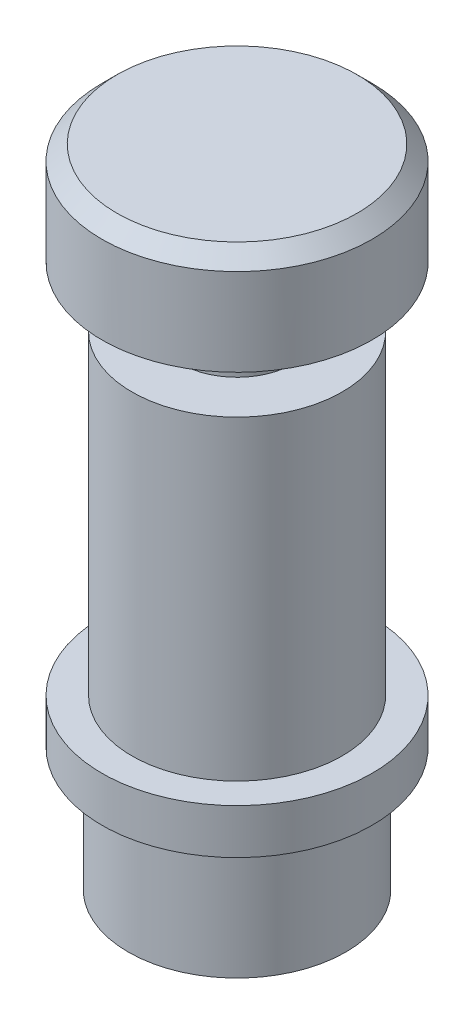
ISO-10303-21;
HEADER;
FILE_DESCRIPTION(('STEP AP214'),'2;1');
FILE_NAME('part.step','',(''),(''),'','','');
FILE_SCHEMA(('AUTOMOTIVE_DESIGN { 1 0 10303 214 1 1 1 1 }'));
ENDSEC;
DATA;
#1=APPLICATION_CONTEXT('core data for automotive mechanical design processes');
#2=APPLICATION_PROTOCOL_DEFINITION('international standard','automotive_design',2000,#1);
#3=PRODUCT_CONTEXT('',#1,'mechanical');
#4=PRODUCT('Part','Part','',(#3));
#5=PRODUCT_RELATED_PRODUCT_CATEGORY('part','',(#4));
#6=PRODUCT_DEFINITION_FORMATION('','',#4);
#7=PRODUCT_DEFINITION_CONTEXT('part definition',#1,'design');
#8=PRODUCT_DEFINITION('design','',#6,#7);
#9=PRODUCT_DEFINITION_SHAPE('','',#8);
#10=(LENGTH_UNIT() NAMED_UNIT(*) SI_UNIT(.MILLI.,.METRE.));
#11=(NAMED_UNIT(*) PLANE_ANGLE_UNIT() SI_UNIT($,.RADIAN.));
#12=(NAMED_UNIT(*) SI_UNIT($,.STERADIAN.) SOLID_ANGLE_UNIT());
#13=UNCERTAINTY_MEASURE_WITH_UNIT(LENGTH_MEASURE(1.E-05),#10,'distance_accuracy_value','');
#14=(GEOMETRIC_REPRESENTATION_CONTEXT(3) GLOBAL_UNCERTAINTY_ASSIGNED_CONTEXT((#13)) GLOBAL_UNIT_ASSIGNED_CONTEXT((#10,
#11,#12)) REPRESENTATION_CONTEXT('',''));
#15=CARTESIAN_POINT('',(0.,0.,0.));
#16=DIRECTION('',(0.,0.,1.));
#17=DIRECTION('',(1.,0.,0.));
#18=AXIS2_PLACEMENT_3D('',#15,#16,#17);
#19=CARTESIAN_POINT('',(0.,0.,0.));
#20=DIRECTION('',(0.,-1.,0.));
#21=DIRECTION('',(0.,0.,-1.));
#22=AXIS2_PLACEMENT_3D('',#19,#20,#21);
#23=PLANE('',#22);
#24=CARTESIAN_POINT('',(0.,0.,0.));
#25=DIRECTION('',(0.,-1.,0.));
#26=DIRECTION('',(0.,0.,-1.));
#27=AXIS2_PLACEMENT_3D('',#24,#25,#26);
#28=CIRCLE('',#27,7.25);
#29=CARTESIAN_POINT('',(0.,0.,-7.25));
#30=VERTEX_POINT('',#29);
#31=EDGE_CURVE('E57',#30,#30,#28,.T.);
#32=ORIENTED_EDGE('',*,*,#31,.T.);
#33=EDGE_LOOP('',(#32));
#34=FACE_BOUND('',#33,.T.);
#35=ADVANCED_FACE('F46',(#34),#23,.T.);
#36=CARTESIAN_POINT('',(0.,0.,0.));
#37=DIRECTION('',(0.,-1.,0.));
#38=DIRECTION('',(0.,0.,-1.));
#39=AXIS2_PLACEMENT_3D('',#36,#37,#38);
#40=CYLINDRICAL_SURFACE('',#39,7.25);
#41=CARTESIAN_POINT('',(0.,8.18859509796432,0.));
#42=DIRECTION('',(0.,-1.,0.));
#43=DIRECTION('',(0.,0.,-1.));
#44=AXIS2_PLACEMENT_3D('',#41,#42,#43);
#45=CIRCLE('',#44,7.25);
#46=CARTESIAN_POINT('',(0.,8.18859509796432,-7.25));
#47=VERTEX_POINT('',#46);
#48=EDGE_CURVE('E61',#47,#47,#45,.T.);
#49=ORIENTED_EDGE('',*,*,#48,.T.);
#50=EDGE_LOOP('',(#49));
#51=FACE_BOUND('',#50,.T.);
#52=ORIENTED_EDGE('',*,*,#31,.F.);
#53=EDGE_LOOP('',(#52));
#54=FACE_BOUND('',#53,.T.);
#55=ADVANCED_FACE('F103',(#51,#54),#40,.T.);
#56=CARTESIAN_POINT('',(7.25,8.18859509796432,0.));
#57=DIRECTION('',(0.,-1.,0.));
#58=DIRECTION('',(0.,0.,-1.));
#59=AXIS2_PLACEMENT_3D('',#56,#57,#58);
#60=PLANE('',#59);
#61=CARTESIAN_POINT('',(0.,8.18859509796432,0.));
#62=DIRECTION('',(0.,-1.,0.));
#63=DIRECTION('',(0.,0.,-1.));
#64=AXIS2_PLACEMENT_3D('',#61,#62,#63);
#65=CIRCLE('',#64,9.);
#66=CARTESIAN_POINT('',(0.,8.18859509796432,-9.));
#67=VERTEX_POINT('',#66);
#68=EDGE_CURVE('E66',#67,#67,#65,.T.);
#69=ORIENTED_EDGE('',*,*,#68,.T.);
#70=EDGE_LOOP('',(#69));
#71=FACE_BOUND('',#70,.T.);
#72=ORIENTED_EDGE('',*,*,#48,.F.);
#73=EDGE_LOOP('',(#72));
#74=FACE_BOUND('',#73,.T.);
#75=ADVANCED_FACE('F108',(#71,#74),#60,.T.);
#76=CARTESIAN_POINT('',(0.,0.,0.));
#77=DIRECTION('',(0.,-1.,0.));
#78=DIRECTION('',(0.,0.,-1.));
#79=AXIS2_PLACEMENT_3D('',#76,#77,#78);
#80=CYLINDRICAL_SURFACE('',#79,9.);
#81=CARTESIAN_POINT('',(0.,11.1885950979643,0.));
#82=DIRECTION('',(0.,-1.,0.));
#83=DIRECTION('',(0.,0.,-1.));
#84=AXIS2_PLACEMENT_3D('',#81,#82,#83);
#85=CIRCLE('',#84,9.);
#86=CARTESIAN_POINT('',(0.,11.1885950979643,-9.));
#87=VERTEX_POINT('',#86);
#88=EDGE_CURVE('E69',#87,#87,#85,.T.);
#89=ORIENTED_EDGE('',*,*,#88,.T.);
#90=EDGE_LOOP('',(#89));
#91=FACE_BOUND('',#90,.T.);
#92=ORIENTED_EDGE('',*,*,#68,.F.);
#93=EDGE_LOOP('',(#92));
#94=FACE_BOUND('',#93,.T.);
#95=ADVANCED_FACE('F114',(#91,#94),#80,.T.);
#96=CARTESIAN_POINT('',(9.,11.1885950979643,0.));
#97=DIRECTION('',(0.,1.,0.));
#98=DIRECTION('',(0.,0.,1.));
#99=AXIS2_PLACEMENT_3D('',#96,#97,#98);
#100=PLANE('',#99);
#101=CARTESIAN_POINT('',(0.,11.1885950979643,0.));
#102=DIRECTION('',(0.,-1.,0.));
#103=DIRECTION('',(0.,0.,-1.));
#104=AXIS2_PLACEMENT_3D('',#101,#102,#103);
#105=CIRCLE('',#104,7.);
#106=CARTESIAN_POINT('',(0.,11.1885950979643,-7.));
#107=VERTEX_POINT('',#106);
#108=EDGE_CURVE('E72',#107,#107,#105,.T.);
#109=ORIENTED_EDGE('',*,*,#108,.T.);
#110=EDGE_LOOP('',(#109));
#111=FACE_BOUND('',#110,.T.);
#112=ORIENTED_EDGE('',*,*,#88,.F.);
#113=EDGE_LOOP('',(#112));
#114=FACE_BOUND('',#113,.T.);
#115=ADVANCED_FACE('F118',(#111,#114),#100,.T.);
#116=CARTESIAN_POINT('',(0.,0.,0.));
#117=DIRECTION('',(0.,-1.,0.));
#118=DIRECTION('',(0.,0.,-1.));
#119=AXIS2_PLACEMENT_3D('',#116,#117,#118);
#120=CYLINDRICAL_SURFACE('',#119,7.);
#121=CARTESIAN_POINT('',(0.,32.1885950979643,0.));
#122=DIRECTION('',(0.,-1.,0.));
#123=DIRECTION('',(0.,0.,-1.));
#124=AXIS2_PLACEMENT_3D('',#121,#122,#123);
#125=CIRCLE('',#124,7.);
#126=CARTESIAN_POINT('',(0.,32.1885950979643,-7.));
#127=VERTEX_POINT('',#126);
#128=EDGE_CURVE('E75',#127,#127,#125,.T.);
#129=ORIENTED_EDGE('',*,*,#128,.T.);
#130=EDGE_LOOP('',(#129));
#131=FACE_BOUND('',#130,.T.);
#132=ORIENTED_EDGE('',*,*,#108,.F.);
#133=EDGE_LOOP('',(#132));
#134=FACE_BOUND('',#133,.T.);
#135=ADVANCED_FACE('F122',(#131,#134),#120,.T.);
#136=CARTESIAN_POINT('',(7.,32.1885950979643,0.));
#137=DIRECTION('',(0.,1.,0.));
#138=DIRECTION('',(0.,0.,1.));
#139=AXIS2_PLACEMENT_3D('',#136,#137,#138);
#140=PLANE('',#139);
#141=CARTESIAN_POINT('',(0.,32.1885950979643,0.));
#142=DIRECTION('',(0.,-1.,0.));
#143=DIRECTION('',(0.,0.,-1.));
#144=AXIS2_PLACEMENT_3D('',#141,#142,#143);
#145=CIRCLE('',#144,3.75);
#146=CARTESIAN_POINT('',(0.,32.1885950979643,-3.75));
#147=VERTEX_POINT('',#146);
#148=EDGE_CURVE('E78',#147,#147,#145,.T.);
#149=ORIENTED_EDGE('',*,*,#148,.T.);
#150=EDGE_LOOP('',(#149));
#151=FACE_BOUND('',#150,.T.);
#152=ORIENTED_EDGE('',*,*,#128,.F.);
#153=EDGE_LOOP('',(#152));
#154=FACE_BOUND('',#153,.T.);
#155=ADVANCED_FACE('F126',(#151,#154),#140,.T.);
#156=CARTESIAN_POINT('',(0.,0.,0.));
#157=DIRECTION('',(0.,-1.,0.));
#158=DIRECTION('',(0.,0.,-1.));
#159=AXIS2_PLACEMENT_3D('',#156,#157,#158);
#160=CYLINDRICAL_SURFACE('',#159,3.75);
#161=CARTESIAN_POINT('',(0.,36.1885950979643,0.));
#162=DIRECTION('',(0.,-1.,0.));
#163=DIRECTION('',(0.,0.,-1.));
#164=AXIS2_PLACEMENT_3D('',#161,#162,#163);
#165=CIRCLE('',#164,3.75);
#166=CARTESIAN_POINT('',(0.,36.1885950979643,-3.75));
#167=VERTEX_POINT('',#166);
#168=EDGE_CURVE('E81',#167,#167,#165,.T.);
#169=ORIENTED_EDGE('',*,*,#168,.T.);
#170=EDGE_LOOP('',(#169));
#171=FACE_BOUND('',#170,.T.);
#172=ORIENTED_EDGE('',*,*,#148,.F.);
#173=EDGE_LOOP('',(#172));
#174=FACE_BOUND('',#173,.T.);
#175=ADVANCED_FACE('F100',(#171,#174),#160,.T.);
#176=CARTESIAN_POINT('',(3.75,36.1885950979643,0.));
#177=DIRECTION('',(0.,-1.,0.));
#178=DIRECTION('',(0.,0.,-1.));
#179=AXIS2_PLACEMENT_3D('',#176,#177,#178);
#180=PLANE('',#179);
#181=CARTESIAN_POINT('',(0.,36.1885950979643,0.));
#182=DIRECTION('',(0.,-1.,0.));
#183=DIRECTION('',(0.,0.,-1.));
#184=AXIS2_PLACEMENT_3D('',#181,#182,#183);
#185=CIRCLE('',#184,9.);
#186=CARTESIAN_POINT('',(0.,36.1885950979643,-9.));
#187=VERTEX_POINT('',#186);
#188=EDGE_CURVE('E84',#187,#187,#185,.T.);
#189=ORIENTED_EDGE('',*,*,#188,.T.);
#190=EDGE_LOOP('',(#189));
#191=FACE_BOUND('',#190,.T.);
#192=ORIENTED_EDGE('',*,*,#168,.F.);
#193=EDGE_LOOP('',(#192));
#194=FACE_BOUND('',#193,.T.);
#195=ADVANCED_FACE('F88',(#191,#194),#180,.T.);
#196=CARTESIAN_POINT('',(0.,0.,0.));
#197=DIRECTION('',(0.,-1.,0.));
#198=DIRECTION('',(0.,0.,-1.));
#199=AXIS2_PLACEMENT_3D('',#196,#197,#198);
#200=CYLINDRICAL_SURFACE('',#199,9.);
#201=CARTESIAN_POINT('',(0.,42.,0.));
#202=DIRECTION('',(0.,1.,0.));
#203=DIRECTION('',(0.,0.,1.));
#204=AXIS2_PLACEMENT_3D('',#201,#202,#203);
#205=CIRCLE('',#204,9.);
#206=CARTESIAN_POINT('',(0.,42.,9.));
#207=VERTEX_POINT('',#206);
#208=EDGE_CURVE('E53',#207,#207,#205,.F.);
#209=ORIENTED_EDGE('',*,*,#208,.T.);
#210=EDGE_LOOP('',(#209));
#211=FACE_BOUND('',#210,.T.);
#212=ORIENTED_EDGE('',*,*,#188,.F.);
#213=EDGE_LOOP('',(#212));
#214=FACE_BOUND('',#213,.T.);
#215=ADVANCED_FACE('F91',(#211,#214),#200,.T.);
#216=CARTESIAN_POINT('',(9.,43.,0.));
#217=DIRECTION('',(0.,1.,0.));
#218=DIRECTION('',(0.,0.,1.));
#219=AXIS2_PLACEMENT_3D('',#216,#217,#218);
#220=PLANE('',#219);
#221=CARTESIAN_POINT('',(0.,43.,0.));
#222=DIRECTION('',(0.,1.,0.));
#223=DIRECTION('',(0.,0.,1.));
#224=AXIS2_PLACEMENT_3D('',#221,#222,#223);
#225=CIRCLE('',#224,7.99999999999999);
#226=CARTESIAN_POINT('',(0.,43.,7.99999999999999));
#227=VERTEX_POINT('',#226);
#228=EDGE_CURVE('E12',#227,#227,#225,.T.);
#229=ORIENTED_EDGE('',*,*,#228,.T.);
#230=EDGE_LOOP('',(#229));
#231=FACE_BOUND('',#230,.T.);
#232=ADVANCED_FACE('F93',(#231),#220,.T.);
#233=CARTESIAN_POINT('',(0.,42.,0.));
#234=DIRECTION('',(0.,-1.,0.));
#235=DIRECTION('',(0.,0.,-1.));
#236=AXIS2_PLACEMENT_3D('',#233,#234,#235);
#237=CONICAL_SURFACE('',#236,9.,0.785398163397453);
#238=ORIENTED_EDGE('',*,*,#228,.F.);
#239=EDGE_LOOP('',(#238));
#240=FACE_BOUND('',#239,.T.);
#241=ORIENTED_EDGE('',*,*,#208,.F.);
#242=EDGE_LOOP('',(#241));
#243=FACE_BOUND('',#242,.T.);
#244=ADVANCED_FACE('F48',(#240,#243),#237,.T.);
#245=CLOSED_SHELL('',(#35,#55,#75,#95,#115,#135,#155,#175,#195,#215,#232,#244));
#246=MANIFOLD_SOLID_BREP('B2',#245);
#247=ADVANCED_BREP_SHAPE_REPRESENTATION('',(#18,#246),#14);
#248=SHAPE_DEFINITION_REPRESENTATION(#9,#247);
ENDSEC;
END-ISO-10303-21;
